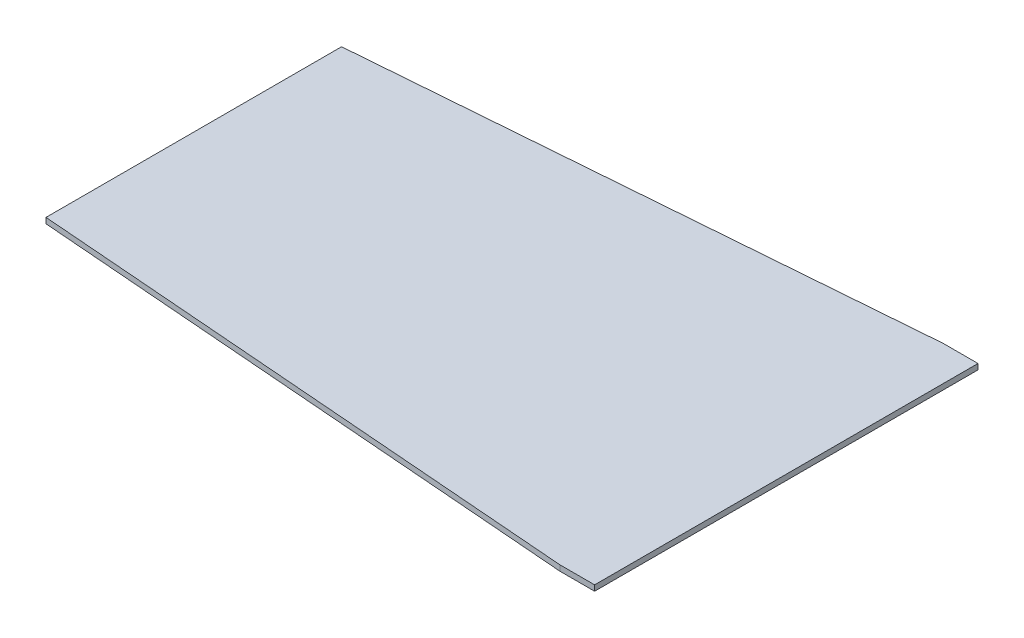
ISO-10303-21;
HEADER;
FILE_DESCRIPTION(('STEP AP214'),'2;1');
FILE_NAME('part.step','',(''),(''),'','','');
FILE_SCHEMA(('AUTOMOTIVE_DESIGN { 1 0 10303 214 1 1 1 1 }'));
ENDSEC;
DATA;
#1=APPLICATION_CONTEXT('core data for automotive mechanical design processes');
#2=APPLICATION_PROTOCOL_DEFINITION('international standard','automotive_design',2000,#1);
#3=PRODUCT_CONTEXT('',#1,'mechanical');
#4=PRODUCT('Part','Part','',(#3));
#5=PRODUCT_RELATED_PRODUCT_CATEGORY('part','',(#4));
#6=PRODUCT_DEFINITION_FORMATION('','',#4);
#7=PRODUCT_DEFINITION_CONTEXT('part definition',#1,'design');
#8=PRODUCT_DEFINITION('design','',#6,#7);
#9=PRODUCT_DEFINITION_SHAPE('','',#8);
#10=(LENGTH_UNIT() NAMED_UNIT(*) SI_UNIT(.MILLI.,.METRE.));
#11=(NAMED_UNIT(*) PLANE_ANGLE_UNIT() SI_UNIT($,.RADIAN.));
#12=(NAMED_UNIT(*) SI_UNIT($,.STERADIAN.) SOLID_ANGLE_UNIT());
#13=UNCERTAINTY_MEASURE_WITH_UNIT(LENGTH_MEASURE(1.E-05),#10,'distance_accuracy_value','');
#14=(GEOMETRIC_REPRESENTATION_CONTEXT(3) GLOBAL_UNCERTAINTY_ASSIGNED_CONTEXT((#13)) GLOBAL_UNIT_ASSIGNED_CONTEXT((#10,
#11,#12)) REPRESENTATION_CONTEXT('',''));
#15=CARTESIAN_POINT('',(0.,0.,0.));
#16=DIRECTION('',(0.,0.,1.));
#17=DIRECTION('',(1.,0.,0.));
#18=AXIS2_PLACEMENT_3D('',#15,#16,#17);
#19=CARTESIAN_POINT('',(-3.175,-0.508,17.4625));
#20=DIRECTION('',(0.,0.,1.));
#21=DIRECTION('',(1.,0.,0.));
#22=AXIS2_PLACEMENT_3D('',#19,#20,#21);
#23=PLANE('',#22);
#24=DIRECTION('',(1.,0.,0.));
#25=VECTOR('',#24,1.);
#26=CARTESIAN_POINT('',(-3.175,0.,17.4625));
#27=LINE('',#26,#25);
#28=CARTESIAN_POINT('',(-3.175,0.,17.4625));
#29=VERTEX_POINT('',#28);
#30=CARTESIAN_POINT('',(0.,0.,17.4625));
#31=VERTEX_POINT('',#30);
#32=EDGE_CURVE('E122',#29,#31,#27,.T.);
#33=ORIENTED_EDGE('',*,*,#32,.F.);
#34=DIRECTION('',(0.,1.,0.));
#35=VECTOR('',#34,1.);
#36=CARTESIAN_POINT('',(-3.175,-0.508,17.4625));
#37=LINE('',#36,#35);
#38=CARTESIAN_POINT('',(-3.175,-0.508,17.4625));
#39=VERTEX_POINT('',#38);
#40=EDGE_CURVE('E11',#39,#29,#37,.T.);
#41=ORIENTED_EDGE('',*,*,#40,.F.);
#42=DIRECTION('',(1.,0.,0.));
#43=VECTOR('',#42,1.);
#44=CARTESIAN_POINT('',(-3.175,-0.508,17.4625));
#45=LINE('',#44,#43);
#46=CARTESIAN_POINT('',(0.,-0.508,17.4625));
#47=VERTEX_POINT('',#46);
#48=EDGE_CURVE('E136',#39,#47,#45,.T.);
#49=ORIENTED_EDGE('',*,*,#48,.T.);
#50=DIRECTION('',(0.,1.,0.));
#51=VECTOR('',#50,1.);
#52=CARTESIAN_POINT('',(0.,-0.508,17.4625));
#53=LINE('',#52,#51);
#54=EDGE_CURVE('E40',#47,#31,#53,.T.);
#55=ORIENTED_EDGE('',*,*,#54,.T.);
#56=EDGE_LOOP('',(#33,#41,#49,#55));
#57=FACE_BOUND('',#56,.T.);
#58=ADVANCED_FACE('F37',(#57),#23,.T.);
#59=CARTESIAN_POINT('',(-53.975,-0.508,13.462));
#60=DIRECTION('',(-0.0785069433921874,0.,0.996913566884921));
#61=DIRECTION('',(0.996913566884921,0.,0.0785069433921874));
#62=AXIS2_PLACEMENT_3D('',#59,#60,#61);
#63=PLANE('',#62);
#64=DIRECTION('',(0.996913566884921,0.,0.0785069433921874));
#65=VECTOR('',#64,1.);
#66=CARTESIAN_POINT('',(-53.975,0.,13.462));
#67=LINE('',#66,#65);
#68=CARTESIAN_POINT('',(-53.975,0.,13.462));
#69=VERTEX_POINT('',#68);
#70=EDGE_CURVE('E134',#69,#29,#67,.T.);
#71=ORIENTED_EDGE('',*,*,#70,.F.);
#72=DIRECTION('',(0.,1.,0.));
#73=VECTOR('',#72,1.);
#74=CARTESIAN_POINT('',(-53.975,-0.508,13.462));
#75=LINE('',#74,#73);
#76=CARTESIAN_POINT('',(-53.975,-0.508,13.462));
#77=VERTEX_POINT('',#76);
#78=EDGE_CURVE('E46',#77,#69,#75,.T.);
#79=ORIENTED_EDGE('',*,*,#78,.F.);
#80=DIRECTION('',(0.996913566884921,0.,0.0785069433921874));
#81=VECTOR('',#80,1.);
#82=CARTESIAN_POINT('',(-53.975,-0.508,13.462));
#83=LINE('',#82,#81);
#84=EDGE_CURVE('E112',#77,#39,#83,.T.);
#85=ORIENTED_EDGE('',*,*,#84,.T.);
#86=ORIENTED_EDGE('',*,*,#40,.T.);
#87=EDGE_LOOP('',(#71,#79,#85,#86));
#88=FACE_BOUND('',#87,.T.);
#89=ADVANCED_FACE('F144',(#88),#63,.T.);
#90=CARTESIAN_POINT('',(-53.975,-0.508,-13.462));
#91=DIRECTION('',(-1.,0.,0.));
#92=DIRECTION('',(0.,0.,1.));
#93=AXIS2_PLACEMENT_3D('',#90,#91,#92);
#94=PLANE('',#93);
#95=DIRECTION('',(0.,0.,1.));
#96=VECTOR('',#95,1.);
#97=CARTESIAN_POINT('',(-53.975,0.,-13.462));
#98=LINE('',#97,#96);
#99=CARTESIAN_POINT('',(-53.975,0.,-13.462));
#100=VERTEX_POINT('',#99);
#101=EDGE_CURVE('E99',#100,#69,#98,.T.);
#102=ORIENTED_EDGE('',*,*,#101,.F.);
#103=DIRECTION('',(0.,1.,0.));
#104=VECTOR('',#103,1.);
#105=CARTESIAN_POINT('',(-53.975,-0.508,-13.462));
#106=LINE('',#105,#104);
#107=CARTESIAN_POINT('',(-53.975,-0.508,-13.462));
#108=VERTEX_POINT('',#107);
#109=EDGE_CURVE('E94',#108,#100,#106,.T.);
#110=ORIENTED_EDGE('',*,*,#109,.F.);
#111=DIRECTION('',(0.,0.,1.));
#112=VECTOR('',#111,1.);
#113=CARTESIAN_POINT('',(-53.975,-0.508,-13.462));
#114=LINE('',#113,#112);
#115=EDGE_CURVE('E97',#108,#77,#114,.T.);
#116=ORIENTED_EDGE('',*,*,#115,.T.);
#117=ORIENTED_EDGE('',*,*,#78,.T.);
#118=EDGE_LOOP('',(#102,#110,#116,#117));
#119=FACE_BOUND('',#118,.T.);
#120=ADVANCED_FACE('F96',(#119),#94,.T.);
#121=CARTESIAN_POINT('',(-3.175,-0.508,-17.4625));
#122=DIRECTION('',(-0.0785069433921877,0.,-0.996913566884921));
#123=DIRECTION('',(-0.996913566884921,0.,0.0785069433921877));
#124=AXIS2_PLACEMENT_3D('',#121,#122,#123);
#125=PLANE('',#124);
#126=DIRECTION('',(-0.996913566884921,0.,0.0785069433921877));
#127=VECTOR('',#126,1.);
#128=CARTESIAN_POINT('',(-3.175,0.,-17.4625));
#129=LINE('',#128,#127);
#130=CARTESIAN_POINT('',(-3.175,0.,-17.4625));
#131=VERTEX_POINT('',#130);
#132=EDGE_CURVE('E131',#131,#100,#129,.T.);
#133=ORIENTED_EDGE('',*,*,#132,.F.);
#134=DIRECTION('',(0.,1.,0.));
#135=VECTOR('',#134,1.);
#136=CARTESIAN_POINT('',(-3.175,-0.508,-17.4625));
#137=LINE('',#136,#135);
#138=CARTESIAN_POINT('',(-3.175,-0.508,-17.4625));
#139=VERTEX_POINT('',#138);
#140=EDGE_CURVE('E104',#139,#131,#137,.T.);
#141=ORIENTED_EDGE('',*,*,#140,.F.);
#142=DIRECTION('',(-0.996913566884921,0.,0.0785069433921877));
#143=VECTOR('',#142,1.);
#144=CARTESIAN_POINT('',(-3.175,-0.508,-17.4625));
#145=LINE('',#144,#143);
#146=EDGE_CURVE('E110',#139,#108,#145,.T.);
#147=ORIENTED_EDGE('',*,*,#146,.T.);
#148=ORIENTED_EDGE('',*,*,#109,.T.);
#149=EDGE_LOOP('',(#133,#141,#147,#148));
#150=FACE_BOUND('',#149,.T.);
#151=ADVANCED_FACE('F114',(#150),#125,.T.);
#152=CARTESIAN_POINT('',(0.,-0.508,-17.4625));
#153=DIRECTION('',(0.,0.,-1.));
#154=DIRECTION('',(-1.,0.,0.));
#155=AXIS2_PLACEMENT_3D('',#152,#153,#154);
#156=PLANE('',#155);
#157=DIRECTION('',(-1.,0.,0.));
#158=VECTOR('',#157,1.);
#159=CARTESIAN_POINT('',(0.,0.,-17.4625));
#160=LINE('',#159,#158);
#161=CARTESIAN_POINT('',(0.,0.,-17.4625));
#162=VERTEX_POINT('',#161);
#163=EDGE_CURVE('E128',#162,#131,#160,.T.);
#164=ORIENTED_EDGE('',*,*,#163,.F.);
#165=DIRECTION('',(0.,1.,0.));
#166=VECTOR('',#165,1.);
#167=CARTESIAN_POINT('',(0.,-0.508,-17.4625));
#168=LINE('',#167,#166);
#169=CARTESIAN_POINT('',(0.,-0.508,-17.4625));
#170=VERTEX_POINT('',#169);
#171=EDGE_CURVE('E139',#170,#162,#168,.T.);
#172=ORIENTED_EDGE('',*,*,#171,.F.);
#173=DIRECTION('',(-1.,0.,0.));
#174=VECTOR('',#173,1.);
#175=CARTESIAN_POINT('',(0.,-0.508,-17.4625));
#176=LINE('',#175,#174);
#177=EDGE_CURVE('E115',#170,#139,#176,.T.);
#178=ORIENTED_EDGE('',*,*,#177,.T.);
#179=ORIENTED_EDGE('',*,*,#140,.T.);
#180=EDGE_LOOP('',(#164,#172,#178,#179));
#181=FACE_BOUND('',#180,.T.);
#182=ADVANCED_FACE('F157',(#181),#156,.T.);
#183=CARTESIAN_POINT('',(0.,-0.508,17.4625));
#184=DIRECTION('',(1.,0.,0.));
#185=DIRECTION('',(0.,0.,-1.));
#186=AXIS2_PLACEMENT_3D('',#183,#184,#185);
#187=PLANE('',#186);
#188=DIRECTION('',(0.,0.,-1.));
#189=VECTOR('',#188,1.);
#190=CARTESIAN_POINT('',(0.,0.,17.4625));
#191=LINE('',#190,#189);
#192=EDGE_CURVE('E125',#31,#162,#191,.T.);
#193=ORIENTED_EDGE('',*,*,#192,.F.);
#194=ORIENTED_EDGE('',*,*,#54,.F.);
#195=DIRECTION('',(0.,0.,-1.));
#196=VECTOR('',#195,1.);
#197=CARTESIAN_POINT('',(0.,-0.508,17.4625));
#198=LINE('',#197,#196);
#199=EDGE_CURVE('E117',#47,#170,#198,.T.);
#200=ORIENTED_EDGE('',*,*,#199,.T.);
#201=ORIENTED_EDGE('',*,*,#171,.T.);
#202=EDGE_LOOP('',(#193,#194,#200,#201));
#203=FACE_BOUND('',#202,.T.);
#204=ADVANCED_FACE('F141',(#203),#187,.T.);
#205=CARTESIAN_POINT('',(0.,-0.508,0.));
#206=DIRECTION('',(0.,1.,0.));
#207=DIRECTION('',(0.,0.,1.));
#208=AXIS2_PLACEMENT_3D('',#205,#206,#207);
#209=PLANE('',#208);
#210=ORIENTED_EDGE('',*,*,#48,.F.);
#211=ORIENTED_EDGE('',*,*,#84,.F.);
#212=ORIENTED_EDGE('',*,*,#115,.F.);
#213=ORIENTED_EDGE('',*,*,#146,.F.);
#214=ORIENTED_EDGE('',*,*,#177,.F.);
#215=ORIENTED_EDGE('',*,*,#199,.F.);
#216=EDGE_LOOP('',(#210,#211,#212,#213,#214,#215));
#217=FACE_BOUND('',#216,.T.);
#218=ADVANCED_FACE('F108',(#217),#209,.F.);
#219=CARTESIAN_POINT('',(0.,0.,0.));
#220=DIRECTION('',(0.,1.,0.));
#221=DIRECTION('',(0.,0.,1.));
#222=AXIS2_PLACEMENT_3D('',#219,#220,#221);
#223=PLANE('',#222);
#224=ORIENTED_EDGE('',*,*,#32,.T.);
#225=ORIENTED_EDGE('',*,*,#192,.T.);
#226=ORIENTED_EDGE('',*,*,#163,.T.);
#227=ORIENTED_EDGE('',*,*,#132,.T.);
#228=ORIENTED_EDGE('',*,*,#101,.T.);
#229=ORIENTED_EDGE('',*,*,#70,.T.);
#230=EDGE_LOOP('',(#224,#225,#226,#227,#228,#229));
#231=FACE_BOUND('',#230,.T.);
#232=ADVANCED_FACE('F143',(#231),#223,.T.);
#233=CLOSED_SHELL('',(#58,#89,#120,#151,#182,#204,#218,#232));
#234=MANIFOLD_SOLID_BREP('B2',#233);
#235=ADVANCED_BREP_SHAPE_REPRESENTATION('',(#18,#234),#14);
#236=SHAPE_DEFINITION_REPRESENTATION(#9,#235);
ENDSEC;
END-ISO-10303-21;
